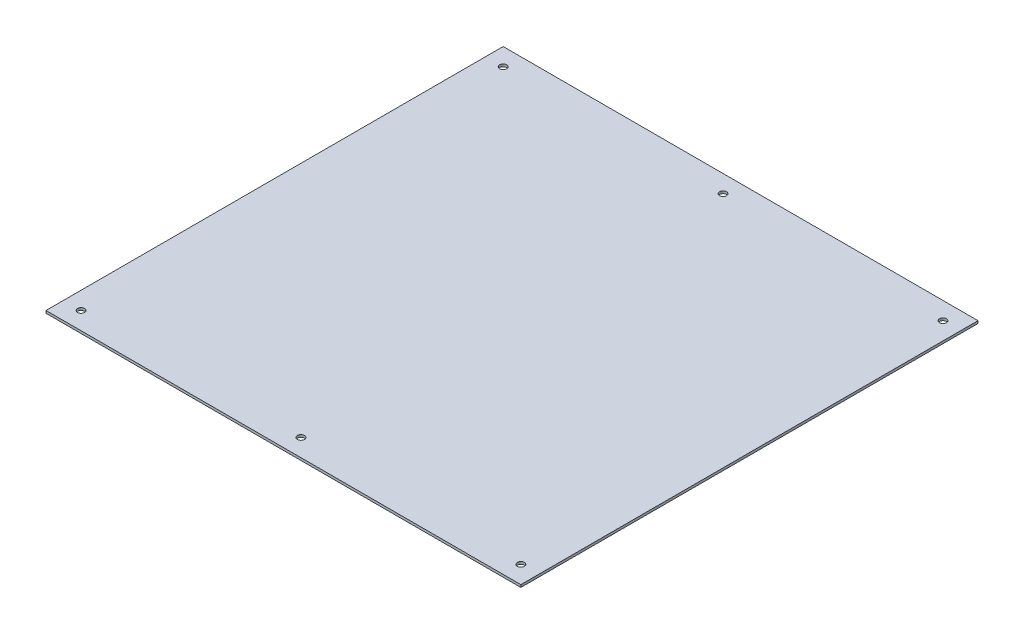
ISO-10303-21;
HEADER;
FILE_DESCRIPTION(('STEP AP214'),'2;1');
FILE_NAME('part.step','',(''),(''),'','','');
FILE_SCHEMA(('AUTOMOTIVE_DESIGN { 1 0 10303 214 1 1 1 1 }'));
ENDSEC;
DATA;
#1=APPLICATION_CONTEXT('core data for automotive mechanical design processes');
#2=APPLICATION_PROTOCOL_DEFINITION('international standard','automotive_design',2000,#1);
#3=PRODUCT_CONTEXT('',#1,'mechanical');
#4=PRODUCT('Part','Part','',(#3));
#5=PRODUCT_RELATED_PRODUCT_CATEGORY('part','',(#4));
#6=PRODUCT_DEFINITION_FORMATION('','',#4);
#7=PRODUCT_DEFINITION_CONTEXT('part definition',#1,'design');
#8=PRODUCT_DEFINITION('design','',#6,#7);
#9=PRODUCT_DEFINITION_SHAPE('','',#8);
#10=(LENGTH_UNIT() NAMED_UNIT(*) SI_UNIT(.MILLI.,.METRE.));
#11=(NAMED_UNIT(*) PLANE_ANGLE_UNIT() SI_UNIT($,.RADIAN.));
#12=(NAMED_UNIT(*) SI_UNIT($,.STERADIAN.) SOLID_ANGLE_UNIT());
#13=UNCERTAINTY_MEASURE_WITH_UNIT(LENGTH_MEASURE(1.E-05),#10,'distance_accuracy_value','');
#14=(GEOMETRIC_REPRESENTATION_CONTEXT(3) GLOBAL_UNCERTAINTY_ASSIGNED_CONTEXT((#13)) GLOBAL_UNIT_ASSIGNED_CONTEXT((#10,
#11,#12)) REPRESENTATION_CONTEXT('',''));
#15=CARTESIAN_POINT('',(0.,0.,0.));
#16=DIRECTION('',(0.,0.,1.));
#17=DIRECTION('',(1.,0.,0.));
#18=AXIS2_PLACEMENT_3D('',#15,#16,#17);
#19=CARTESIAN_POINT('',(304.8,3.175,-293.449999967));
#20=DIRECTION('',(-1.,0.,0.));
#21=DIRECTION('',(0.,0.,1.));
#22=AXIS2_PLACEMENT_3D('',#19,#20,#21);
#23=PLANE('',#22);
#24=DIRECTION('',(0.,0.,-1.));
#25=VECTOR('',#24,1.);
#26=CARTESIAN_POINT('',(304.8,0.,-293.449999967));
#27=LINE('',#26,#25);
#28=CARTESIAN_POINT('',(304.8,0.,293.449999967));
#29=VERTEX_POINT('',#28);
#30=CARTESIAN_POINT('',(304.8,0.,-293.449999967));
#31=VERTEX_POINT('',#30);
#32=EDGE_CURVE('E102',#29,#31,#27,.T.);
#33=ORIENTED_EDGE('',*,*,#32,.T.);
#34=DIRECTION('',(0.,-1.,0.));
#35=VECTOR('',#34,1.);
#36=CARTESIAN_POINT('',(304.8,3.175,-293.449999967));
#37=LINE('',#36,#35);
#38=CARTESIAN_POINT('',(304.8,3.175,-293.449999967));
#39=VERTEX_POINT('',#38);
#40=EDGE_CURVE('E11',#39,#31,#37,.T.);
#41=ORIENTED_EDGE('',*,*,#40,.F.);
#42=DIRECTION('',(0.,0.,-1.));
#43=VECTOR('',#42,1.);
#44=CARTESIAN_POINT('',(304.8,3.175,-293.449999967));
#45=LINE('',#44,#43);
#46=CARTESIAN_POINT('',(304.8,3.175,293.449999967));
#47=VERTEX_POINT('',#46);
#48=EDGE_CURVE('E90',#47,#39,#45,.T.);
#49=ORIENTED_EDGE('',*,*,#48,.F.);
#50=DIRECTION('',(0.,-1.,0.));
#51=VECTOR('',#50,1.);
#52=CARTESIAN_POINT('',(304.8,3.175,293.449999967));
#53=LINE('',#52,#51);
#54=EDGE_CURVE('E98',#47,#29,#53,.T.);
#55=ORIENTED_EDGE('',*,*,#54,.T.);
#56=EDGE_LOOP('',(#33,#41,#49,#55));
#57=FACE_BOUND('',#56,.T.);
#58=ADVANCED_FACE('F39',(#57),#23,.F.);
#59=CARTESIAN_POINT('',(-304.8,3.175,-293.449999967));
#60=DIRECTION('',(0.,0.,1.));
#61=DIRECTION('',(1.,0.,0.));
#62=AXIS2_PLACEMENT_3D('',#59,#60,#61);
#63=PLANE('',#62);
#64=DIRECTION('',(-1.,0.,0.));
#65=VECTOR('',#64,1.);
#66=CARTESIAN_POINT('',(-304.8,0.,-293.449999967));
#67=LINE('',#66,#65);
#68=CARTESIAN_POINT('',(-304.8,0.,-293.449999967));
#69=VERTEX_POINT('',#68);
#70=EDGE_CURVE('E94',#31,#69,#67,.T.);
#71=ORIENTED_EDGE('',*,*,#70,.T.);
#72=DIRECTION('',(0.,-1.,0.));
#73=VECTOR('',#72,1.);
#74=CARTESIAN_POINT('',(-304.8,3.175,-293.449999967));
#75=LINE('',#74,#73);
#76=CARTESIAN_POINT('',(-304.8,3.175,-293.449999967));
#77=VERTEX_POINT('',#76);
#78=EDGE_CURVE('E47',#77,#69,#75,.T.);
#79=ORIENTED_EDGE('',*,*,#78,.F.);
#80=DIRECTION('',(-1.,0.,0.));
#81=VECTOR('',#80,1.);
#82=CARTESIAN_POINT('',(-304.8,3.175,-293.449999967));
#83=LINE('',#82,#81);
#84=EDGE_CURVE('E85',#39,#77,#83,.T.);
#85=ORIENTED_EDGE('',*,*,#84,.F.);
#86=ORIENTED_EDGE('',*,*,#40,.T.);
#87=EDGE_LOOP('',(#71,#79,#85,#86));
#88=FACE_BOUND('',#87,.T.);
#89=ADVANCED_FACE('F93',(#88),#63,.F.);
#90=CARTESIAN_POINT('',(-304.8,3.175,-293.449999967));
#91=DIRECTION('',(1.,0.,0.));
#92=DIRECTION('',(0.,0.,-1.));
#93=AXIS2_PLACEMENT_3D('',#90,#91,#92);
#94=PLANE('',#93);
#95=DIRECTION('',(0.,0.,1.));
#96=VECTOR('',#95,1.);
#97=CARTESIAN_POINT('',(-304.8,0.,-293.449999967));
#98=LINE('',#97,#96);
#99=CARTESIAN_POINT('',(-304.8,0.,293.449999967));
#100=VERTEX_POINT('',#99);
#101=EDGE_CURVE('E72',#69,#100,#98,.T.);
#102=ORIENTED_EDGE('',*,*,#101,.T.);
#103=DIRECTION('',(0.,-1.,0.));
#104=VECTOR('',#103,1.);
#105=CARTESIAN_POINT('',(-304.8,3.175,293.449999967));
#106=LINE('',#105,#104);
#107=CARTESIAN_POINT('',(-304.8,3.175,293.449999967));
#108=VERTEX_POINT('',#107);
#109=EDGE_CURVE('E95',#108,#100,#106,.T.);
#110=ORIENTED_EDGE('',*,*,#109,.F.);
#111=DIRECTION('',(0.,0.,1.));
#112=VECTOR('',#111,1.);
#113=CARTESIAN_POINT('',(-304.8,3.175,-293.449999967));
#114=LINE('',#113,#112);
#115=EDGE_CURVE('E88',#77,#108,#114,.T.);
#116=ORIENTED_EDGE('',*,*,#115,.F.);
#117=ORIENTED_EDGE('',*,*,#78,.T.);
#118=EDGE_LOOP('',(#102,#110,#116,#117));
#119=FACE_BOUND('',#118,.T.);
#120=ADVANCED_FACE('F96',(#119),#94,.F.);
#121=CARTESIAN_POINT('',(-304.8,3.175,293.449999967));
#122=DIRECTION('',(0.,0.,-1.));
#123=DIRECTION('',(-1.,0.,0.));
#124=AXIS2_PLACEMENT_3D('',#121,#122,#123);
#125=PLANE('',#124);
#126=DIRECTION('',(1.,0.,0.));
#127=VECTOR('',#126,1.);
#128=CARTESIAN_POINT('',(-304.8,0.,293.449999967));
#129=LINE('',#128,#127);
#130=EDGE_CURVE('E78',#100,#29,#129,.T.);
#131=ORIENTED_EDGE('',*,*,#130,.T.);
#132=ORIENTED_EDGE('',*,*,#54,.F.);
#133=DIRECTION('',(1.,0.,0.));
#134=VECTOR('',#133,1.);
#135=CARTESIAN_POINT('',(-304.8,3.175,293.449999967));
#136=LINE('',#135,#134);
#137=EDGE_CURVE('E55',#108,#47,#136,.T.);
#138=ORIENTED_EDGE('',*,*,#137,.F.);
#139=ORIENTED_EDGE('',*,*,#109,.T.);
#140=EDGE_LOOP('',(#131,#132,#138,#139));
#141=FACE_BOUND('',#140,.T.);
#142=ADVANCED_FACE('F110',(#141),#125,.F.);
#143=CARTESIAN_POINT('',(0.,3.175,0.));
#144=DIRECTION('',(0.,1.,0.));
#145=DIRECTION('',(0.,0.,1.));
#146=AXIS2_PLACEMENT_3D('',#143,#144,#145);
#147=PLANE('',#146);
#148=CARTESIAN_POINT('',(-282.3,3.175,-270.949999967));
#149=DIRECTION('',(0.,1.,0.));
#150=DIRECTION('',(0.,0.,1.));
#151=AXIS2_PLACEMENT_3D('',#148,#149,#150);
#152=CIRCLE('',#151,4.50000001700002);
#153=CARTESIAN_POINT('',(-282.3,3.175,-266.44999995));
#154=VERTEX_POINT('',#153);
#155=EDGE_CURVE('E148',#154,#154,#152,.T.);
#156=ORIENTED_EDGE('',*,*,#155,.F.);
#157=EDGE_LOOP('',(#156));
#158=FACE_BOUND('',#157,.T.);
#159=CARTESIAN_POINT('',(0.,3.175,-270.949999967));
#160=DIRECTION('',(0.,1.,0.));
#161=DIRECTION('',(0.,0.,1.));
#162=AXIS2_PLACEMENT_3D('',#159,#160,#161);
#163=CIRCLE('',#162,4.500000017);
#164=CARTESIAN_POINT('',(0.,3.175,-266.44999995));
#165=VERTEX_POINT('',#164);
#166=EDGE_CURVE('E142',#165,#165,#163,.T.);
#167=ORIENTED_EDGE('',*,*,#166,.F.);
#168=EDGE_LOOP('',(#167));
#169=FACE_BOUND('',#168,.T.);
#170=CARTESIAN_POINT('',(282.3,3.175,-270.949999967));
#171=DIRECTION('',(0.,1.,0.));
#172=DIRECTION('',(0.,0.,1.));
#173=AXIS2_PLACEMENT_3D('',#170,#171,#172);
#174=CIRCLE('',#173,4.50000001700002);
#175=CARTESIAN_POINT('',(282.3,3.175,-266.44999995));
#176=VERTEX_POINT('',#175);
#177=EDGE_CURVE('E136',#176,#176,#174,.T.);
#178=ORIENTED_EDGE('',*,*,#177,.F.);
#179=EDGE_LOOP('',(#178));
#180=FACE_BOUND('',#179,.T.);
#181=CARTESIAN_POINT('',(282.3,3.175,270.949999967));
#182=DIRECTION('',(0.,1.,0.));
#183=DIRECTION('',(0.,0.,1.));
#184=AXIS2_PLACEMENT_3D('',#181,#182,#183);
#185=CIRCLE('',#184,4.50000001700002);
#186=CARTESIAN_POINT('',(282.3,3.175,275.449999984));
#187=VERTEX_POINT('',#186);
#188=EDGE_CURVE('E130',#187,#187,#185,.T.);
#189=ORIENTED_EDGE('',*,*,#188,.F.);
#190=EDGE_LOOP('',(#189));
#191=FACE_BOUND('',#190,.T.);
#192=CARTESIAN_POINT('',(0.,3.175,270.949999967));
#193=DIRECTION('',(0.,1.,0.));
#194=DIRECTION('',(0.,0.,1.));
#195=AXIS2_PLACEMENT_3D('',#192,#193,#194);
#196=CIRCLE('',#195,4.500000017);
#197=CARTESIAN_POINT('',(0.,3.175,275.449999984));
#198=VERTEX_POINT('',#197);
#199=EDGE_CURVE('E124',#198,#198,#196,.T.);
#200=ORIENTED_EDGE('',*,*,#199,.F.);
#201=EDGE_LOOP('',(#200));
#202=FACE_BOUND('',#201,.T.);
#203=CARTESIAN_POINT('',(-282.3,3.175,270.949999967));
#204=DIRECTION('',(0.,1.,0.));
#205=DIRECTION('',(0.,0.,1.));
#206=AXIS2_PLACEMENT_3D('',#203,#204,#205);
#207=CIRCLE('',#206,4.50000001700002);
#208=CARTESIAN_POINT('',(-282.3,3.175,275.449999984));
#209=VERTEX_POINT('',#208);
#210=EDGE_CURVE('E118',#209,#209,#207,.T.);
#211=ORIENTED_EDGE('',*,*,#210,.F.);
#212=EDGE_LOOP('',(#211));
#213=FACE_BOUND('',#212,.T.);
#214=ORIENTED_EDGE('',*,*,#48,.T.);
#215=ORIENTED_EDGE('',*,*,#84,.T.);
#216=ORIENTED_EDGE('',*,*,#115,.T.);
#217=ORIENTED_EDGE('',*,*,#137,.T.);
#218=EDGE_LOOP('',(#214,#215,#216,#217));
#219=FACE_BOUND('',#218,.T.);
#220=ADVANCED_FACE('F86',(#158,#169,#180,#191,#202,#213,#219),#147,.T.);
#221=CARTESIAN_POINT('',(0.,0.,0.));
#222=DIRECTION('',(0.,1.,0.));
#223=DIRECTION('',(0.,0.,1.));
#224=AXIS2_PLACEMENT_3D('',#221,#222,#223);
#225=PLANE('',#224);
#226=CARTESIAN_POINT('',(-282.3,0.,-270.949999967));
#227=DIRECTION('',(0.,1.,0.));
#228=DIRECTION('',(0.,0.,1.));
#229=AXIS2_PLACEMENT_3D('',#226,#227,#228);
#230=CIRCLE('',#229,4.50000001700002);
#231=CARTESIAN_POINT('',(-282.3,0.,-266.44999995));
#232=VERTEX_POINT('',#231);
#233=EDGE_CURVE('E145',#232,#232,#230,.T.);
#234=ORIENTED_EDGE('',*,*,#233,.T.);
#235=EDGE_LOOP('',(#234));
#236=FACE_BOUND('',#235,.T.);
#237=CARTESIAN_POINT('',(0.,0.,-270.949999967));
#238=DIRECTION('',(0.,1.,0.));
#239=DIRECTION('',(0.,0.,1.));
#240=AXIS2_PLACEMENT_3D('',#237,#238,#239);
#241=CIRCLE('',#240,4.500000017);
#242=CARTESIAN_POINT('',(0.,0.,-266.44999995));
#243=VERTEX_POINT('',#242);
#244=EDGE_CURVE('E139',#243,#243,#241,.T.);
#245=ORIENTED_EDGE('',*,*,#244,.T.);
#246=EDGE_LOOP('',(#245));
#247=FACE_BOUND('',#246,.T.);
#248=CARTESIAN_POINT('',(282.3,0.,-270.949999967));
#249=DIRECTION('',(0.,1.,0.));
#250=DIRECTION('',(0.,0.,1.));
#251=AXIS2_PLACEMENT_3D('',#248,#249,#250);
#252=CIRCLE('',#251,4.50000001700002);
#253=CARTESIAN_POINT('',(282.3,0.,-266.44999995));
#254=VERTEX_POINT('',#253);
#255=EDGE_CURVE('E133',#254,#254,#252,.T.);
#256=ORIENTED_EDGE('',*,*,#255,.T.);
#257=EDGE_LOOP('',(#256));
#258=FACE_BOUND('',#257,.T.);
#259=CARTESIAN_POINT('',(282.3,0.,270.949999967));
#260=DIRECTION('',(0.,1.,0.));
#261=DIRECTION('',(0.,0.,1.));
#262=AXIS2_PLACEMENT_3D('',#259,#260,#261);
#263=CIRCLE('',#262,4.50000001700002);
#264=CARTESIAN_POINT('',(282.3,0.,275.449999984));
#265=VERTEX_POINT('',#264);
#266=EDGE_CURVE('E127',#265,#265,#263,.T.);
#267=ORIENTED_EDGE('',*,*,#266,.T.);
#268=EDGE_LOOP('',(#267));
#269=FACE_BOUND('',#268,.T.);
#270=CARTESIAN_POINT('',(0.,0.,270.949999967));
#271=DIRECTION('',(0.,1.,0.));
#272=DIRECTION('',(0.,0.,1.));
#273=AXIS2_PLACEMENT_3D('',#270,#271,#272);
#274=CIRCLE('',#273,4.500000017);
#275=CARTESIAN_POINT('',(0.,0.,275.449999984));
#276=VERTEX_POINT('',#275);
#277=EDGE_CURVE('E121',#276,#276,#274,.T.);
#278=ORIENTED_EDGE('',*,*,#277,.T.);
#279=EDGE_LOOP('',(#278));
#280=FACE_BOUND('',#279,.T.);
#281=CARTESIAN_POINT('',(-282.3,0.,270.949999967));
#282=DIRECTION('',(0.,1.,0.));
#283=DIRECTION('',(0.,0.,1.));
#284=AXIS2_PLACEMENT_3D('',#281,#282,#283);
#285=CIRCLE('',#284,4.50000001700002);
#286=CARTESIAN_POINT('',(-282.3,0.,275.449999984));
#287=VERTEX_POINT('',#286);
#288=EDGE_CURVE('E105',#287,#287,#285,.T.);
#289=ORIENTED_EDGE('',*,*,#288,.T.);
#290=EDGE_LOOP('',(#289));
#291=FACE_BOUND('',#290,.T.);
#292=ORIENTED_EDGE('',*,*,#32,.F.);
#293=ORIENTED_EDGE('',*,*,#130,.F.);
#294=ORIENTED_EDGE('',*,*,#101,.F.);
#295=ORIENTED_EDGE('',*,*,#70,.F.);
#296=EDGE_LOOP('',(#292,#293,#294,#295));
#297=FACE_BOUND('',#296,.T.);
#298=ADVANCED_FACE('F113',(#236,#247,#258,#269,#280,#291,#297),#225,.F.);
#299=CARTESIAN_POINT('',(-282.3,3.175,270.949999967));
#300=DIRECTION('',(0.,1.,0.));
#301=DIRECTION('',(0.,0.,1.));
#302=AXIS2_PLACEMENT_3D('',#299,#300,#301);
#303=CYLINDRICAL_SURFACE('',#302,4.50000001700002);
#304=ORIENTED_EDGE('',*,*,#288,.F.);
#305=EDGE_LOOP('',(#304));
#306=FACE_BOUND('',#305,.T.);
#307=ORIENTED_EDGE('',*,*,#210,.T.);
#308=EDGE_LOOP('',(#307));
#309=FACE_BOUND('',#308,.T.);
#310=ADVANCED_FACE('F167',(#306,#309),#303,.F.);
#311=CARTESIAN_POINT('',(0.,3.175,270.949999967));
#312=DIRECTION('',(0.,1.,0.));
#313=DIRECTION('',(0.,0.,1.));
#314=AXIS2_PLACEMENT_3D('',#311,#312,#313);
#315=CYLINDRICAL_SURFACE('',#314,4.500000017);
#316=ORIENTED_EDGE('',*,*,#277,.F.);
#317=EDGE_LOOP('',(#316));
#318=FACE_BOUND('',#317,.T.);
#319=ORIENTED_EDGE('',*,*,#199,.T.);
#320=EDGE_LOOP('',(#319));
#321=FACE_BOUND('',#320,.T.);
#322=ADVANCED_FACE('F169',(#318,#321),#315,.F.);
#323=CARTESIAN_POINT('',(282.3,3.175,270.949999967));
#324=DIRECTION('',(0.,1.,0.));
#325=DIRECTION('',(0.,0.,1.));
#326=AXIS2_PLACEMENT_3D('',#323,#324,#325);
#327=CYLINDRICAL_SURFACE('',#326,4.50000001700002);
#328=ORIENTED_EDGE('',*,*,#266,.F.);
#329=EDGE_LOOP('',(#328));
#330=FACE_BOUND('',#329,.T.);
#331=ORIENTED_EDGE('',*,*,#188,.T.);
#332=EDGE_LOOP('',(#331));
#333=FACE_BOUND('',#332,.T.);
#334=ADVANCED_FACE('F176',(#330,#333),#327,.F.);
#335=CARTESIAN_POINT('',(282.3,3.175,-270.949999967));
#336=DIRECTION('',(0.,1.,0.));
#337=DIRECTION('',(0.,0.,1.));
#338=AXIS2_PLACEMENT_3D('',#335,#336,#337);
#339=CYLINDRICAL_SURFACE('',#338,4.50000001700002);
#340=ORIENTED_EDGE('',*,*,#255,.F.);
#341=EDGE_LOOP('',(#340));
#342=FACE_BOUND('',#341,.T.);
#343=ORIENTED_EDGE('',*,*,#177,.T.);
#344=EDGE_LOOP('',(#343));
#345=FACE_BOUND('',#344,.T.);
#346=ADVANCED_FACE('F226',(#342,#345),#339,.F.);
#347=CARTESIAN_POINT('',(0.,3.175,-270.949999967));
#348=DIRECTION('',(0.,1.,0.));
#349=DIRECTION('',(0.,0.,1.));
#350=AXIS2_PLACEMENT_3D('',#347,#348,#349);
#351=CYLINDRICAL_SURFACE('',#350,4.500000017);
#352=ORIENTED_EDGE('',*,*,#244,.F.);
#353=EDGE_LOOP('',(#352));
#354=FACE_BOUND('',#353,.T.);
#355=ORIENTED_EDGE('',*,*,#166,.T.);
#356=EDGE_LOOP('',(#355));
#357=FACE_BOUND('',#356,.T.);
#358=ADVANCED_FACE('F236',(#354,#357),#351,.F.);
#359=CARTESIAN_POINT('',(-282.3,3.175,-270.949999967));
#360=DIRECTION('',(0.,1.,0.));
#361=DIRECTION('',(0.,0.,1.));
#362=AXIS2_PLACEMENT_3D('',#359,#360,#361);
#363=CYLINDRICAL_SURFACE('',#362,4.50000001700002);
#364=ORIENTED_EDGE('',*,*,#233,.F.);
#365=EDGE_LOOP('',(#364));
#366=FACE_BOUND('',#365,.T.);
#367=ORIENTED_EDGE('',*,*,#155,.T.);
#368=EDGE_LOOP('',(#367));
#369=FACE_BOUND('',#368,.T.);
#370=ADVANCED_FACE('F152',(#366,#369),#363,.F.);
#371=CLOSED_SHELL('',(#58,#89,#120,#142,#220,#298,#310,#322,#334,#346,#358,#370));
#372=MANIFOLD_SOLID_BREP('B2',#371);
#373=ADVANCED_BREP_SHAPE_REPRESENTATION('',(#18,#372),#14);
#374=SHAPE_DEFINITION_REPRESENTATION(#9,#373);
ENDSEC;
END-ISO-10303-21;
